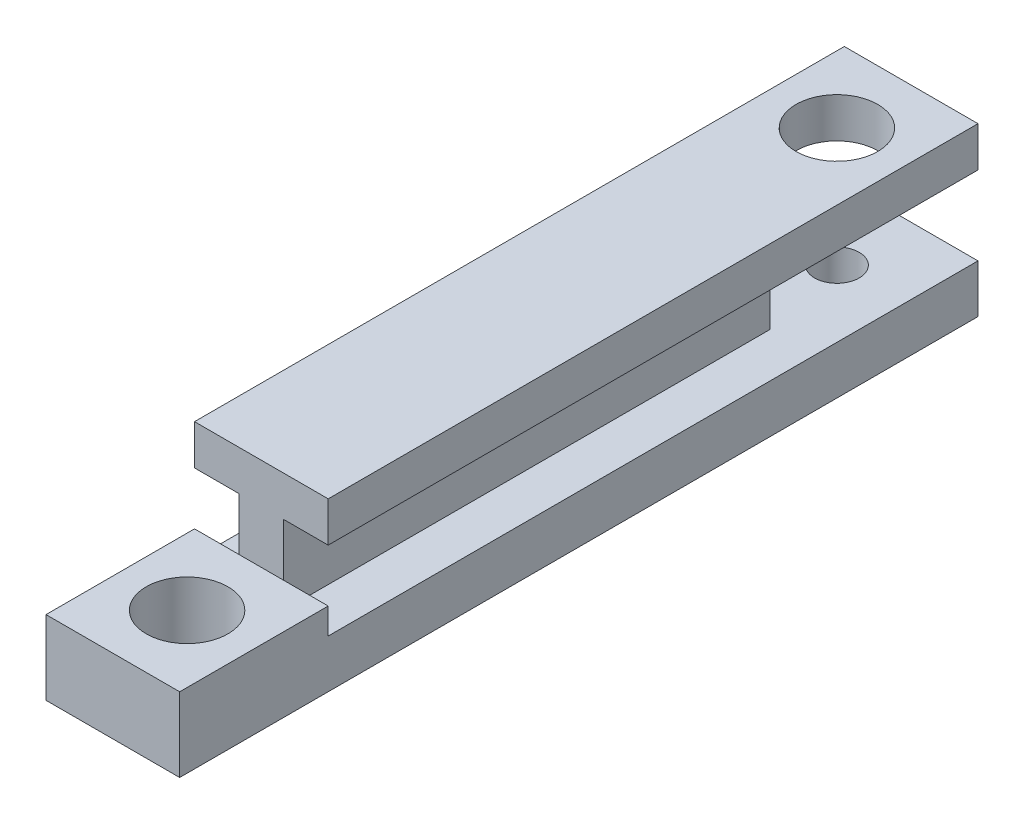
ISO-10303-21;
HEADER;
FILE_DESCRIPTION(('STEP AP214'),'2;1');
FILE_NAME('part.step','',(''),(''),'','','');
FILE_SCHEMA(('AUTOMOTIVE_DESIGN { 1 0 10303 214 1 1 1 1 }'));
ENDSEC;
DATA;
#1=APPLICATION_CONTEXT('core data for automotive mechanical design processes');
#2=APPLICATION_PROTOCOL_DEFINITION('international standard','automotive_design',2000,#1);
#3=PRODUCT_CONTEXT('',#1,'mechanical');
#4=PRODUCT('Part','Part','',(#3));
#5=PRODUCT_RELATED_PRODUCT_CATEGORY('part','',(#4));
#6=PRODUCT_DEFINITION_FORMATION('','',#4);
#7=PRODUCT_DEFINITION_CONTEXT('part definition',#1,'design');
#8=PRODUCT_DEFINITION('design','',#6,#7);
#9=PRODUCT_DEFINITION_SHAPE('','',#8);
#10=(LENGTH_UNIT() NAMED_UNIT(*) SI_UNIT(.MILLI.,.METRE.));
#11=(NAMED_UNIT(*) PLANE_ANGLE_UNIT() SI_UNIT($,.RADIAN.));
#12=(NAMED_UNIT(*) SI_UNIT($,.STERADIAN.) SOLID_ANGLE_UNIT());
#13=UNCERTAINTY_MEASURE_WITH_UNIT(LENGTH_MEASURE(1.E-05),#10,'distance_accuracy_value','');
#14=(GEOMETRIC_REPRESENTATION_CONTEXT(3) GLOBAL_UNCERTAINTY_ASSIGNED_CONTEXT((#13)) GLOBAL_UNIT_ASSIGNED_CONTEXT((#10,
#11,#12)) REPRESENTATION_CONTEXT('',''));
#15=CARTESIAN_POINT('',(0.,0.,0.));
#16=DIRECTION('',(0.,0.,1.));
#17=DIRECTION('',(1.,0.,0.));
#18=AXIS2_PLACEMENT_3D('',#15,#16,#17);
#19=CARTESIAN_POINT('',(18.,13.,44.));
#20=DIRECTION('',(0.,0.,1.));
#21=DIRECTION('',(0.,-1.,0.));
#22=AXIS2_PLACEMENT_3D('',#19,#20,#21);
#23=PLANE('',#22);
#24=DIRECTION('',(0.,1.,0.));
#25=VECTOR('',#24,1.);
#26=CARTESIAN_POINT('',(6.,0.,44.));
#27=LINE('',#26,#25);
#28=CARTESIAN_POINT('',(6.,13.,44.));
#29=VERTEX_POINT('',#28);
#30=CARTESIAN_POINT('',(6.,34.2,44.));
#31=VERTEX_POINT('',#30);
#32=EDGE_CURVE('E317',#29,#31,#27,.T.);
#33=ORIENTED_EDGE('',*,*,#32,.F.);
#34=DIRECTION('',(-1.,0.,0.));
#35=VECTOR('',#34,1.);
#36=CARTESIAN_POINT('',(18.,13.,44.));
#37=LINE('',#36,#35);
#38=CARTESIAN_POINT('',(-6.,13.,44.));
#39=VERTEX_POINT('',#38);
#40=EDGE_CURVE('E177',#29,#39,#37,.T.);
#41=ORIENTED_EDGE('',*,*,#40,.T.);
#42=DIRECTION('',(0.,1.,0.));
#43=VECTOR('',#42,1.);
#44=CARTESIAN_POINT('',(-6.,0.,44.));
#45=LINE('',#44,#43);
#46=CARTESIAN_POINT('',(-6.,34.2,44.));
#47=VERTEX_POINT('',#46);
#48=EDGE_CURVE('E285',#39,#47,#45,.T.);
#49=ORIENTED_EDGE('',*,*,#48,.T.);
#50=DIRECTION('',(-1.,0.,0.));
#51=VECTOR('',#50,1.);
#52=CARTESIAN_POINT('',(18.,34.2,44.));
#53=LINE('',#52,#51);
#54=EDGE_CURVE('E174',#31,#47,#53,.T.);
#55=ORIENTED_EDGE('',*,*,#54,.F.);
#56=EDGE_LOOP('',(#33,#41,#49,#55));
#57=FACE_BOUND('',#56,.T.);
#58=ADVANCED_FACE('F35',(#57),#23,.F.);
#59=CARTESIAN_POINT('',(18.,20.,175.));
#60=DIRECTION('',(0.,0.,-1.));
#61=DIRECTION('',(-1.,0.,0.));
#62=AXIS2_PLACEMENT_3D('',#59,#60,#61);
#63=PLANE('',#62);
#64=DIRECTION('',(1.,0.,0.));
#65=VECTOR('',#64,1.);
#66=CARTESIAN_POINT('',(6.,34.2,175.));
#67=LINE('',#66,#65);
#68=CARTESIAN_POINT('',(6.,34.2,175.));
#69=VERTEX_POINT('',#68);
#70=CARTESIAN_POINT('',(18.,34.2,175.));
#71=VERTEX_POINT('',#70);
#72=EDGE_CURVE('E137',#69,#71,#67,.T.);
#73=ORIENTED_EDGE('',*,*,#72,.T.);
#74=DIRECTION('',(0.,-1.,0.));
#75=VECTOR('',#74,1.);
#76=CARTESIAN_POINT('',(18.,20.,175.));
#77=LINE('',#76,#75);
#78=CARTESIAN_POINT('',(18.,45.,175.));
#79=VERTEX_POINT('',#78);
#80=EDGE_CURVE('E115',#79,#71,#77,.T.);
#81=ORIENTED_EDGE('',*,*,#80,.F.);
#82=DIRECTION('',(-1.,0.,0.));
#83=VECTOR('',#82,1.);
#84=CARTESIAN_POINT('',(18.,45.,175.));
#85=LINE('',#84,#83);
#86=CARTESIAN_POINT('',(-18.,45.,175.));
#87=VERTEX_POINT('',#86);
#88=EDGE_CURVE('E123',#79,#87,#85,.T.);
#89=ORIENTED_EDGE('',*,*,#88,.T.);
#90=DIRECTION('',(0.,-1.,0.));
#91=VECTOR('',#90,1.);
#92=CARTESIAN_POINT('',(-18.,20.,175.));
#93=LINE('',#92,#91);
#94=CARTESIAN_POINT('',(-18.,34.2,175.));
#95=VERTEX_POINT('',#94);
#96=EDGE_CURVE('E156',#87,#95,#93,.T.);
#97=ORIENTED_EDGE('',*,*,#96,.T.);
#98=DIRECTION('',(-1.,0.,0.));
#99=VECTOR('',#98,1.);
#100=CARTESIAN_POINT('',(-6.,34.2,175.));
#101=LINE('',#100,#99);
#102=CARTESIAN_POINT('',(-6.,34.2,175.));
#103=VERTEX_POINT('',#102);
#104=EDGE_CURVE('E223',#103,#95,#101,.T.);
#105=ORIENTED_EDGE('',*,*,#104,.F.);
#106=DIRECTION('',(0.,1.,0.));
#107=VECTOR('',#106,1.);
#108=CARTESIAN_POINT('',(-6.,0.,175.));
#109=LINE('',#108,#107);
#110=CARTESIAN_POINT('',(-6.,20.,175.));
#111=VERTEX_POINT('',#110);
#112=EDGE_CURVE('E265',#111,#103,#109,.T.);
#113=ORIENTED_EDGE('',*,*,#112,.F.);
#114=DIRECTION('',(-1.,0.,0.));
#115=VECTOR('',#114,1.);
#116=CARTESIAN_POINT('',(18.,20.,175.));
#117=LINE('',#116,#115);
#118=CARTESIAN_POINT('',(6.,20.,175.));
#119=VERTEX_POINT('',#118);
#120=EDGE_CURVE('E167',#119,#111,#117,.T.);
#121=ORIENTED_EDGE('',*,*,#120,.F.);
#122=DIRECTION('',(0.,1.,0.));
#123=VECTOR('',#122,1.);
#124=CARTESIAN_POINT('',(6.,0.,175.));
#125=LINE('',#124,#123);
#126=EDGE_CURVE('E247',#119,#69,#125,.T.);
#127=ORIENTED_EDGE('',*,*,#126,.T.);
#128=EDGE_LOOP('',(#73,#81,#89,#97,#105,#113,#121,#127));
#129=FACE_BOUND('',#128,.T.);
#130=ADVANCED_FACE('F134',(#129),#63,.F.);
#131=CARTESIAN_POINT('',(18.,0.,0.));
#132=DIRECTION('',(1.,0.,0.));
#133=DIRECTION('',(0.,0.,-1.));
#134=AXIS2_PLACEMENT_3D('',#131,#132,#133);
#135=PLANE('',#134);
#136=ORIENTED_EDGE('',*,*,#80,.T.);
#137=DIRECTION('',(0.,0.,-1.));
#138=VECTOR('',#137,1.);
#139=CARTESIAN_POINT('',(18.,34.2,44.));
#140=LINE('',#139,#138);
#141=CARTESIAN_POINT('',(18.,34.2,0.));
#142=VERTEX_POINT('',#141);
#143=EDGE_CURVE('E207',#71,#142,#140,.T.);
#144=ORIENTED_EDGE('',*,*,#143,.T.);
#145=DIRECTION('',(0.,1.,0.));
#146=VECTOR('',#145,1.);
#147=CARTESIAN_POINT('',(18.,34.2,0.));
#148=LINE('',#147,#146);
#149=CARTESIAN_POINT('',(18.,45.,0.));
#150=VERTEX_POINT('',#149);
#151=EDGE_CURVE('E117',#142,#150,#148,.T.);
#152=ORIENTED_EDGE('',*,*,#151,.T.);
#153=DIRECTION('',(0.,0.,1.));
#154=VECTOR('',#153,1.);
#155=CARTESIAN_POINT('',(18.,45.,175.));
#156=LINE('',#155,#154);
#157=EDGE_CURVE('E110',#150,#79,#156,.T.);
#158=ORIENTED_EDGE('',*,*,#157,.T.);
#159=EDGE_LOOP('',(#136,#144,#152,#158));
#160=FACE_BOUND('',#159,.T.);
#161=ADVANCED_FACE('F112',(#160),#135,.T.);
#162=DIRECTION('',(0.,0.,1.));
#163=VECTOR('',#162,1.);
#164=CARTESIAN_POINT('',(18.,13.,0.));
#165=LINE('',#164,#163);
#166=CARTESIAN_POINT('',(18.,13.,0.));
#167=VERTEX_POINT('',#166);
#168=CARTESIAN_POINT('',(18.,13.,175.));
#169=VERTEX_POINT('',#168);
#170=EDGE_CURVE('E52',#167,#169,#165,.T.);
#171=ORIENTED_EDGE('',*,*,#170,.T.);
#172=DIRECTION('',(0.,1.,0.));
#173=VECTOR('',#172,1.);
#174=CARTESIAN_POINT('',(18.,0.,175.));
#175=LINE('',#174,#173);
#176=CARTESIAN_POINT('',(18.,20.,175.));
#177=VERTEX_POINT('',#176);
#178=EDGE_CURVE('E256',#169,#177,#175,.T.);
#179=ORIENTED_EDGE('',*,*,#178,.T.);
#180=DIRECTION('',(0.,0.,1.));
#181=VECTOR('',#180,1.);
#182=CARTESIAN_POINT('',(18.,20.,215.));
#183=LINE('',#182,#181);
#184=CARTESIAN_POINT('',(18.,20.,215.));
#185=VERTEX_POINT('',#184);
#186=EDGE_CURVE('E138',#177,#185,#183,.T.);
#187=ORIENTED_EDGE('',*,*,#186,.T.);
#188=DIRECTION('',(0.,-1.,0.));
#189=VECTOR('',#188,1.);
#190=CARTESIAN_POINT('',(18.,0.,215.));
#191=LINE('',#190,#189);
#192=CARTESIAN_POINT('',(18.,0.,215.));
#193=VERTEX_POINT('',#192);
#194=EDGE_CURVE('E60',#185,#193,#191,.T.);
#195=ORIENTED_EDGE('',*,*,#194,.T.);
#196=DIRECTION('',(0.,0.,-1.));
#197=VECTOR('',#196,1.);
#198=CARTESIAN_POINT('',(18.,0.,215.));
#199=LINE('',#198,#197);
#200=CARTESIAN_POINT('',(18.,0.,0.));
#201=VERTEX_POINT('',#200);
#202=EDGE_CURVE('E95',#193,#201,#199,.T.);
#203=ORIENTED_EDGE('',*,*,#202,.T.);
#204=DIRECTION('',(0.,1.,0.));
#205=VECTOR('',#204,1.);
#206=CARTESIAN_POINT('',(18.,0.,0.));
#207=LINE('',#206,#205);
#208=EDGE_CURVE('E204',#201,#167,#207,.T.);
#209=ORIENTED_EDGE('',*,*,#208,.T.);
#210=EDGE_LOOP('',(#171,#179,#187,#195,#203,#209));
#211=FACE_BOUND('',#210,.T.);
#212=ADVANCED_FACE('F271',(#211),#135,.T.);
#213=CARTESIAN_POINT('',(-18.,0.,0.));
#214=DIRECTION('',(1.,0.,0.));
#215=DIRECTION('',(0.,0.,-1.));
#216=AXIS2_PLACEMENT_3D('',#213,#214,#215);
#217=PLANE('',#216);
#218=DIRECTION('',(0.,0.,-1.));
#219=VECTOR('',#218,1.);
#220=CARTESIAN_POINT('',(-18.,34.2,44.));
#221=LINE('',#220,#219);
#222=CARTESIAN_POINT('',(-18.,34.2,0.));
#223=VERTEX_POINT('',#222);
#224=EDGE_CURVE('E151',#95,#223,#221,.T.);
#225=ORIENTED_EDGE('',*,*,#224,.F.);
#226=ORIENTED_EDGE('',*,*,#96,.F.);
#227=DIRECTION('',(0.,0.,1.));
#228=VECTOR('',#227,1.);
#229=CARTESIAN_POINT('',(-18.,45.,175.));
#230=LINE('',#229,#228);
#231=CARTESIAN_POINT('',(-18.,45.,0.));
#232=VERTEX_POINT('',#231);
#233=EDGE_CURVE('E126',#232,#87,#230,.T.);
#234=ORIENTED_EDGE('',*,*,#233,.F.);
#235=DIRECTION('',(0.,1.,0.));
#236=VECTOR('',#235,1.);
#237=CARTESIAN_POINT('',(-18.,34.2,0.));
#238=LINE('',#237,#236);
#239=EDGE_CURVE('E153',#223,#232,#238,.T.);
#240=ORIENTED_EDGE('',*,*,#239,.F.);
#241=EDGE_LOOP('',(#225,#226,#234,#240));
#242=FACE_BOUND('',#241,.T.);
#243=ADVANCED_FACE('F218',(#242),#217,.F.);
#244=DIRECTION('',(0.,1.,0.));
#245=VECTOR('',#244,1.);
#246=CARTESIAN_POINT('',(-18.,0.,175.));
#247=LINE('',#246,#245);
#248=CARTESIAN_POINT('',(-18.,13.,175.));
#249=VERTEX_POINT('',#248);
#250=CARTESIAN_POINT('',(-18.,20.,175.));
#251=VERTEX_POINT('',#250);
#252=EDGE_CURVE('E291',#249,#251,#247,.T.);
#253=ORIENTED_EDGE('',*,*,#252,.F.);
#254=DIRECTION('',(0.,0.,1.));
#255=VECTOR('',#254,1.);
#256=CARTESIAN_POINT('',(-18.,13.,0.));
#257=LINE('',#256,#255);
#258=CARTESIAN_POINT('',(-18.,13.,0.));
#259=VERTEX_POINT('',#258);
#260=EDGE_CURVE('E148',#259,#249,#257,.T.);
#261=ORIENTED_EDGE('',*,*,#260,.F.);
#262=DIRECTION('',(0.,1.,0.));
#263=VECTOR('',#262,1.);
#264=CARTESIAN_POINT('',(-18.,0.,0.));
#265=LINE('',#264,#263);
#266=CARTESIAN_POINT('',(-18.,0.,0.));
#267=VERTEX_POINT('',#266);
#268=EDGE_CURVE('E146',#267,#259,#265,.T.);
#269=ORIENTED_EDGE('',*,*,#268,.F.);
#270=DIRECTION('',(0.,0.,-1.));
#271=VECTOR('',#270,1.);
#272=CARTESIAN_POINT('',(-18.,0.,44.));
#273=LINE('',#272,#271);
#274=CARTESIAN_POINT('',(-18.,0.,215.));
#275=VERTEX_POINT('',#274);
#276=EDGE_CURVE('E90',#275,#267,#273,.T.);
#277=ORIENTED_EDGE('',*,*,#276,.F.);
#278=DIRECTION('',(0.,-1.,0.));
#279=VECTOR('',#278,1.);
#280=CARTESIAN_POINT('',(-18.,0.,215.));
#281=LINE('',#280,#279);
#282=CARTESIAN_POINT('',(-18.,20.,215.));
#283=VERTEX_POINT('',#282);
#284=EDGE_CURVE('E160',#283,#275,#281,.T.);
#285=ORIENTED_EDGE('',*,*,#284,.F.);
#286=DIRECTION('',(0.,0.,1.));
#287=VECTOR('',#286,1.);
#288=CARTESIAN_POINT('',(-18.,20.,215.));
#289=LINE('',#288,#287);
#290=EDGE_CURVE('E158',#251,#283,#289,.T.);
#291=ORIENTED_EDGE('',*,*,#290,.F.);
#292=EDGE_LOOP('',(#253,#261,#269,#277,#285,#291));
#293=FACE_BOUND('',#292,.T.);
#294=ADVANCED_FACE('F302',(#293),#217,.F.);
#295=CARTESIAN_POINT('',(18.,0.,44.));
#296=DIRECTION('',(0.,1.,0.));
#297=DIRECTION('',(0.,0.,1.));
#298=AXIS2_PLACEMENT_3D('',#295,#296,#297);
#299=PLANE('',#298);
#300=CARTESIAN_POINT('',(0.,0.,20.));
#301=DIRECTION('',(0.,1.,0.));
#302=DIRECTION('',(0.,0.,1.));
#303=AXIS2_PLACEMENT_3D('',#300,#301,#302);
#304=CIRCLE('',#303,6.);
#305=CARTESIAN_POINT('',(0.,0.,26.));
#306=VERTEX_POINT('',#305);
#307=EDGE_CURVE('E185',#306,#306,#304,.T.);
#308=ORIENTED_EDGE('',*,*,#307,.T.);
#309=EDGE_LOOP('',(#308));
#310=FACE_BOUND('',#309,.T.);
#311=CARTESIAN_POINT('',(0.,0.,195.));
#312=DIRECTION('',(0.,1.,0.));
#313=DIRECTION('',(0.,0.,1.));
#314=AXIS2_PLACEMENT_3D('',#311,#312,#313);
#315=CIRCLE('',#314,11.);
#316=CARTESIAN_POINT('',(0.,0.,206.));
#317=VERTEX_POINT('',#316);
#318=EDGE_CURVE('E191',#317,#317,#315,.T.);
#319=ORIENTED_EDGE('',*,*,#318,.T.);
#320=EDGE_LOOP('',(#319));
#321=FACE_BOUND('',#320,.T.);
#322=ORIENTED_EDGE('',*,*,#276,.T.);
#323=DIRECTION('',(-1.,0.,0.));
#324=VECTOR('',#323,1.);
#325=CARTESIAN_POINT('',(18.,0.,0.));
#326=LINE('',#325,#324);
#327=EDGE_CURVE('E11',#201,#267,#326,.T.);
#328=ORIENTED_EDGE('',*,*,#327,.F.);
#329=ORIENTED_EDGE('',*,*,#202,.F.);
#330=DIRECTION('',(-1.,0.,0.));
#331=VECTOR('',#330,1.);
#332=CARTESIAN_POINT('',(18.,0.,215.));
#333=LINE('',#332,#331);
#334=EDGE_CURVE('E144',#193,#275,#333,.T.);
#335=ORIENTED_EDGE('',*,*,#334,.T.);
#336=EDGE_LOOP('',(#322,#328,#329,#335));
#337=FACE_BOUND('',#336,.T.);
#338=ADVANCED_FACE('F306',(#310,#321,#337),#299,.F.);
#339=CARTESIAN_POINT('',(18.,0.,0.));
#340=DIRECTION('',(0.,0.,1.));
#341=DIRECTION('',(1.,0.,0.));
#342=AXIS2_PLACEMENT_3D('',#339,#340,#341);
#343=PLANE('',#342);
#344=ORIENTED_EDGE('',*,*,#268,.T.);
#345=DIRECTION('',(-1.,0.,0.));
#346=VECTOR('',#345,1.);
#347=CARTESIAN_POINT('',(18.,13.,0.));
#348=LINE('',#347,#346);
#349=EDGE_CURVE('E44',#167,#259,#348,.T.);
#350=ORIENTED_EDGE('',*,*,#349,.F.);
#351=ORIENTED_EDGE('',*,*,#208,.F.);
#352=ORIENTED_EDGE('',*,*,#327,.T.);
#353=EDGE_LOOP('',(#344,#350,#351,#352));
#354=FACE_BOUND('',#353,.T.);
#355=ADVANCED_FACE('F310',(#354),#343,.F.);
#356=CARTESIAN_POINT('',(18.,13.,0.));
#357=DIRECTION('',(0.,-1.,0.));
#358=DIRECTION('',(0.,0.,-1.));
#359=AXIS2_PLACEMENT_3D('',#356,#357,#358);
#360=PLANE('',#359);
#361=CARTESIAN_POINT('',(0.,13.,20.));
#362=DIRECTION('',(0.,-1.,0.));
#363=DIRECTION('',(0.,0.,-1.));
#364=AXIS2_PLACEMENT_3D('',#361,#362,#363);
#365=CIRCLE('',#364,6.);
#366=CARTESIAN_POINT('',(0.,13.,26.));
#367=VERTEX_POINT('',#366);
#368=EDGE_CURVE('E39',#367,#367,#365,.T.);
#369=ORIENTED_EDGE('',*,*,#368,.T.);
#370=EDGE_LOOP('',(#369));
#371=FACE_BOUND('',#370,.T.);
#372=ORIENTED_EDGE('',*,*,#260,.T.);
#373=DIRECTION('',(-1.,0.,0.));
#374=VECTOR('',#373,1.);
#375=CARTESIAN_POINT('',(-6.,13.,175.));
#376=LINE('',#375,#374);
#377=CARTESIAN_POINT('',(-6.,13.,175.));
#378=VERTEX_POINT('',#377);
#379=EDGE_CURVE('E273',#378,#249,#376,.T.);
#380=ORIENTED_EDGE('',*,*,#379,.F.);
#381=DIRECTION('',(0.,0.,1.));
#382=VECTOR('',#381,1.);
#383=CARTESIAN_POINT('',(-6.,13.,0.));
#384=LINE('',#383,#382);
#385=EDGE_CURVE('E283',#39,#378,#384,.T.);
#386=ORIENTED_EDGE('',*,*,#385,.F.);
#387=ORIENTED_EDGE('',*,*,#40,.F.);
#388=DIRECTION('',(0.,0.,1.));
#389=VECTOR('',#388,1.);
#390=CARTESIAN_POINT('',(6.,13.,0.));
#391=LINE('',#390,#389);
#392=CARTESIAN_POINT('',(6.,13.,175.));
#393=VERTEX_POINT('',#392);
#394=EDGE_CURVE('E262',#29,#393,#391,.T.);
#395=ORIENTED_EDGE('',*,*,#394,.T.);
#396=DIRECTION('',(1.,0.,0.));
#397=VECTOR('',#396,1.);
#398=CARTESIAN_POINT('',(6.,13.,175.));
#399=LINE('',#398,#397);
#400=EDGE_CURVE('E261',#393,#169,#399,.T.);
#401=ORIENTED_EDGE('',*,*,#400,.T.);
#402=ORIENTED_EDGE('',*,*,#170,.F.);
#403=ORIENTED_EDGE('',*,*,#349,.T.);
#404=EDGE_LOOP('',(#372,#380,#386,#387,#395,#401,#402,#403));
#405=FACE_BOUND('',#404,.T.);
#406=ADVANCED_FACE('F311',(#371,#405),#360,.F.);
#407=CARTESIAN_POINT('',(18.,34.2,44.));
#408=DIRECTION('',(0.,1.,0.));
#409=DIRECTION('',(0.,0.,1.));
#410=AXIS2_PLACEMENT_3D('',#407,#408,#409);
#411=PLANE('',#410);
#412=CARTESIAN_POINT('',(0.,34.2,20.));
#413=DIRECTION('',(0.,1.,0.));
#414=DIRECTION('',(0.,0.,1.));
#415=AXIS2_PLACEMENT_3D('',#412,#413,#414);
#416=CIRCLE('',#415,11.);
#417=CARTESIAN_POINT('',(0.,34.2,31.));
#418=VERTEX_POINT('',#417);
#419=EDGE_CURVE('E184',#418,#418,#416,.T.);
#420=ORIENTED_EDGE('',*,*,#419,.T.);
#421=EDGE_LOOP('',(#420));
#422=FACE_BOUND('',#421,.T.);
#423=ORIENTED_EDGE('',*,*,#224,.T.);
#424=DIRECTION('',(-1.,0.,0.));
#425=VECTOR('',#424,1.);
#426=CARTESIAN_POINT('',(18.,34.2,0.));
#427=LINE('',#426,#425);
#428=EDGE_CURVE('E171',#142,#223,#427,.T.);
#429=ORIENTED_EDGE('',*,*,#428,.F.);
#430=ORIENTED_EDGE('',*,*,#143,.F.);
#431=ORIENTED_EDGE('',*,*,#72,.F.);
#432=DIRECTION('',(0.,0.,-1.));
#433=VECTOR('',#432,1.);
#434=CARTESIAN_POINT('',(6.,34.2,0.));
#435=LINE('',#434,#433);
#436=EDGE_CURVE('E254',#69,#31,#435,.T.);
#437=ORIENTED_EDGE('',*,*,#436,.T.);
#438=ORIENTED_EDGE('',*,*,#54,.T.);
#439=DIRECTION('',(0.,0.,-1.));
#440=VECTOR('',#439,1.);
#441=CARTESIAN_POINT('',(-6.,34.2,0.));
#442=LINE('',#441,#440);
#443=EDGE_CURVE('E288',#103,#47,#442,.T.);
#444=ORIENTED_EDGE('',*,*,#443,.F.);
#445=ORIENTED_EDGE('',*,*,#104,.T.);
#446=EDGE_LOOP('',(#423,#429,#430,#431,#437,#438,#444,#445));
#447=FACE_BOUND('',#446,.T.);
#448=ADVANCED_FACE('F211',(#422,#447),#411,.F.);
#449=CARTESIAN_POINT('',(18.,34.2,0.));
#450=DIRECTION('',(0.,0.,1.));
#451=DIRECTION('',(1.,0.,0.));
#452=AXIS2_PLACEMENT_3D('',#449,#450,#451);
#453=PLANE('',#452);
#454=ORIENTED_EDGE('',*,*,#239,.T.);
#455=DIRECTION('',(-1.,0.,0.));
#456=VECTOR('',#455,1.);
#457=CARTESIAN_POINT('',(18.,45.,0.));
#458=LINE('',#457,#456);
#459=EDGE_CURVE('E130',#150,#232,#458,.T.);
#460=ORIENTED_EDGE('',*,*,#459,.F.);
#461=ORIENTED_EDGE('',*,*,#151,.F.);
#462=ORIENTED_EDGE('',*,*,#428,.T.);
#463=EDGE_LOOP('',(#454,#460,#461,#462));
#464=FACE_BOUND('',#463,.T.);
#465=ADVANCED_FACE('F216',(#464),#453,.F.);
#466=CARTESIAN_POINT('',(18.,45.,175.));
#467=DIRECTION('',(0.,-1.,0.));
#468=DIRECTION('',(0.,0.,-1.));
#469=AXIS2_PLACEMENT_3D('',#466,#467,#468);
#470=PLANE('',#469);
#471=CARTESIAN_POINT('',(0.,45.,20.));
#472=DIRECTION('',(0.,1.,0.));
#473=DIRECTION('',(0.,0.,1.));
#474=AXIS2_PLACEMENT_3D('',#471,#472,#473);
#475=CIRCLE('',#474,11.);
#476=CARTESIAN_POINT('',(0.,45.,31.));
#477=VERTEX_POINT('',#476);
#478=EDGE_CURVE('E187',#477,#477,#475,.T.);
#479=ORIENTED_EDGE('',*,*,#478,.F.);
#480=EDGE_LOOP('',(#479));
#481=FACE_BOUND('',#480,.T.);
#482=ORIENTED_EDGE('',*,*,#233,.T.);
#483=ORIENTED_EDGE('',*,*,#88,.F.);
#484=ORIENTED_EDGE('',*,*,#157,.F.);
#485=ORIENTED_EDGE('',*,*,#459,.T.);
#486=EDGE_LOOP('',(#482,#483,#484,#485));
#487=FACE_BOUND('',#486,.T.);
#488=ADVANCED_FACE('F124',(#481,#487),#470,.F.);
#489=CARTESIAN_POINT('',(18.,20.,215.));
#490=DIRECTION('',(0.,-1.,0.));
#491=DIRECTION('',(0.,0.,-1.));
#492=AXIS2_PLACEMENT_3D('',#489,#490,#491);
#493=PLANE('',#492);
#494=CARTESIAN_POINT('',(0.,20.,195.));
#495=DIRECTION('',(0.,-1.,0.));
#496=DIRECTION('',(0.,0.,-1.));
#497=AXIS2_PLACEMENT_3D('',#494,#495,#496);
#498=CIRCLE('',#497,11.);
#499=CARTESIAN_POINT('',(0.,20.,206.));
#500=VERTEX_POINT('',#499);
#501=EDGE_CURVE('E182',#500,#500,#498,.T.);
#502=ORIENTED_EDGE('',*,*,#501,.T.);
#503=EDGE_LOOP('',(#502));
#504=FACE_BOUND('',#503,.T.);
#505=ORIENTED_EDGE('',*,*,#290,.T.);
#506=DIRECTION('',(-1.,0.,0.));
#507=VECTOR('',#506,1.);
#508=CARTESIAN_POINT('',(18.,20.,215.));
#509=LINE('',#508,#507);
#510=EDGE_CURVE('E164',#185,#283,#509,.T.);
#511=ORIENTED_EDGE('',*,*,#510,.F.);
#512=ORIENTED_EDGE('',*,*,#186,.F.);
#513=EDGE_CURVE('E131',#177,#119,#117,.T.);
#514=ORIENTED_EDGE('',*,*,#513,.T.);
#515=ORIENTED_EDGE('',*,*,#120,.T.);
#516=DIRECTION('',(1.,0.,0.));
#517=VECTOR('',#516,1.);
#518=CARTESIAN_POINT('',(18.,20.,175.));
#519=LINE('',#518,#517);
#520=EDGE_CURVE('E196',#251,#111,#519,.T.);
#521=ORIENTED_EDGE('',*,*,#520,.F.);
#522=EDGE_LOOP('',(#505,#511,#512,#514,#515,#521));
#523=FACE_BOUND('',#522,.T.);
#524=ADVANCED_FACE('F269',(#504,#523),#493,.F.);
#525=CARTESIAN_POINT('',(18.,0.,215.));
#526=DIRECTION('',(0.,0.,-1.));
#527=DIRECTION('',(0.,1.,0.));
#528=AXIS2_PLACEMENT_3D('',#525,#526,#527);
#529=PLANE('',#528);
#530=ORIENTED_EDGE('',*,*,#284,.T.);
#531=ORIENTED_EDGE('',*,*,#334,.F.);
#532=ORIENTED_EDGE('',*,*,#194,.F.);
#533=ORIENTED_EDGE('',*,*,#510,.T.);
#534=EDGE_LOOP('',(#530,#531,#532,#533));
#535=FACE_BOUND('',#534,.T.);
#536=ADVANCED_FACE('F304',(#535),#529,.F.);
#537=CARTESIAN_POINT('',(0.,0.,195.));
#538=DIRECTION('',(0.,1.,0.));
#539=DIRECTION('',(0.,0.,1.));
#540=AXIS2_PLACEMENT_3D('',#537,#538,#539);
#541=CYLINDRICAL_SURFACE('',#540,11.);
#542=CARTESIAN_POINT('',(0.,0.,206.));
#543=CARTESIAN_POINT('',(0.,0.208333333333334,206.));
#544=CARTESIAN_POINT('',(0.,0.416666666666667,206.));
#545=CARTESIAN_POINT('',(0.,0.833333333333333,206.));
#546=CARTESIAN_POINT('',(0.,1.04166666666667,206.));
#547=CARTESIAN_POINT('',(0.,1.45833333333333,206.));
#548=CARTESIAN_POINT('',(0.,1.66666666666667,206.));
#549=CARTESIAN_POINT('',(0.,2.08333333333333,206.));
#550=CARTESIAN_POINT('',(0.,2.29166666666667,206.));
#551=CARTESIAN_POINT('',(0.,2.70833333333333,206.));
#552=CARTESIAN_POINT('',(0.,2.91666666666667,206.));
#553=CARTESIAN_POINT('',(0.,3.33333333333333,206.));
#554=CARTESIAN_POINT('',(0.,3.54166666666667,206.));
#555=CARTESIAN_POINT('',(0.,3.95833333333333,206.));
#556=CARTESIAN_POINT('',(0.,4.16666666666667,206.));
#557=CARTESIAN_POINT('',(0.,4.58333333333333,206.));
#558=CARTESIAN_POINT('',(0.,4.79166666666667,206.));
#559=CARTESIAN_POINT('',(0.,5.20833333333333,206.));
#560=CARTESIAN_POINT('',(0.,5.41666666666667,206.));
#561=CARTESIAN_POINT('',(0.,5.83333333333333,206.));
#562=CARTESIAN_POINT('',(0.,6.04166666666667,206.));
#563=CARTESIAN_POINT('',(0.,6.45833333333333,206.));
#564=CARTESIAN_POINT('',(0.,6.66666666666667,206.));
#565=CARTESIAN_POINT('',(0.,7.08333333333333,206.));
#566=CARTESIAN_POINT('',(0.,7.29166666666667,206.));
#567=CARTESIAN_POINT('',(0.,7.70833333333333,206.));
#568=CARTESIAN_POINT('',(0.,7.91666666666667,206.));
#569=CARTESIAN_POINT('',(0.,8.33333333333333,206.));
#570=CARTESIAN_POINT('',(0.,8.54166666666667,206.));
#571=CARTESIAN_POINT('',(0.,8.95833333333333,206.));
#572=CARTESIAN_POINT('',(0.,9.16666666666667,206.));
#573=CARTESIAN_POINT('',(0.,9.58333333333333,206.));
#574=CARTESIAN_POINT('',(0.,9.79166666666667,206.));
#575=CARTESIAN_POINT('',(0.,10.2083333333333,206.));
#576=CARTESIAN_POINT('',(0.,10.4166666666667,206.));
#577=CARTESIAN_POINT('',(0.,10.8333333333333,206.));
#578=CARTESIAN_POINT('',(0.,11.0416666666667,206.));
#579=CARTESIAN_POINT('',(0.,11.4583333333333,206.));
#580=CARTESIAN_POINT('',(0.,11.6666666666667,206.));
#581=CARTESIAN_POINT('',(0.,12.0833333333333,206.));
#582=CARTESIAN_POINT('',(0.,12.2916666666667,206.));
#583=CARTESIAN_POINT('',(0.,12.7083333333333,206.));
#584=CARTESIAN_POINT('',(0.,12.9166666666667,206.));
#585=CARTESIAN_POINT('',(0.,13.3333333333333,206.));
#586=CARTESIAN_POINT('',(0.,13.5416666666667,206.));
#587=CARTESIAN_POINT('',(0.,13.9583333333333,206.));
#588=CARTESIAN_POINT('',(0.,14.1666666666667,206.));
#589=CARTESIAN_POINT('',(0.,14.5833333333333,206.));
#590=CARTESIAN_POINT('',(0.,14.7916666666667,206.));
#591=CARTESIAN_POINT('',(0.,15.2083333333333,206.));
#592=CARTESIAN_POINT('',(0.,15.4166666666667,206.));
#593=CARTESIAN_POINT('',(0.,15.8333333333333,206.));
#594=CARTESIAN_POINT('',(0.,16.0416666666667,206.));
#595=CARTESIAN_POINT('',(0.,16.4583333333333,206.));
#596=CARTESIAN_POINT('',(0.,16.6666666666667,206.));
#597=CARTESIAN_POINT('',(0.,17.0833333333333,206.));
#598=CARTESIAN_POINT('',(0.,17.2916666666667,206.));
#599=CARTESIAN_POINT('',(0.,17.7083333333333,206.));
#600=CARTESIAN_POINT('',(0.,17.9166666666667,206.));
#601=CARTESIAN_POINT('',(0.,18.3333333333333,206.));
#602=CARTESIAN_POINT('',(0.,18.5416666666667,206.));
#603=CARTESIAN_POINT('',(0.,18.9583333333333,206.));
#604=CARTESIAN_POINT('',(0.,19.1666666666667,206.));
#605=CARTESIAN_POINT('',(0.,19.5833333333333,206.));
#606=CARTESIAN_POINT('',(0.,19.7916666666667,206.));
#607=CARTESIAN_POINT('',(0.,20.,206.));
#608=B_SPLINE_CURVE_WITH_KNOTS('',3,(#542,#543,#544,#545,#546,#547,#548,#549,#550,#551,#552,
#553,#554,#555,#556,#557,#558,#559,#560,#561,#562,#563,#564,#565,#566,#567,#568,#569,#570,#571,
#572,#573,#574,#575,#576,#577,#578,#579,#580,#581,#582,#583,#584,#585,#586,#587,#588,#589,#590,
#591,#592,#593,#594,#595,#596,#597,#598,#599,#600,#601,#602,#603,#604,#605,#606,#607),
.UNSPECIFIED.,.F.,.F.,(4,2,2,2,2,2,2,2,2,2,2,2,2,2,2,2,2,2,2,2,2,2,2,2,2,2,2,2,2,2,2,2,4),(0.,
0.625,1.25,1.875,2.5,3.125,3.75,4.375,5.,5.625,6.25,6.875,7.5,8.125,8.75,9.375,10.,10.625,11.25,
11.875,12.5,13.125,13.75,14.375,15.,15.625,16.25,16.875,17.5,18.125,18.75,19.375,20.),.UNSPECIFIED.);
#609=EDGE_CURVE('BSEAM354',#317,#500,#608,.T.);
#610=ORIENTED_EDGE('',*,*,#318,.F.);
#611=ORIENTED_EDGE('',*,*,#501,.F.);
#612=ORIENTED_EDGE('',*,*,#609,.T.);
#613=ORIENTED_EDGE('',*,*,#609,.F.);
#614=EDGE_LOOP('',(#610,#612,#611,#613));
#615=FACE_BOUND('',#614,.T.);
#616=ADVANCED_FACE('F354',(#615),#541,.F.);
#617=CARTESIAN_POINT('',(0.,0.,20.));
#618=DIRECTION('',(0.,1.,0.));
#619=DIRECTION('',(0.,0.,1.));
#620=AXIS2_PLACEMENT_3D('',#617,#618,#619);
#621=CYLINDRICAL_SURFACE('',#620,11.);
#622=CARTESIAN_POINT('',(0.,45.,31.));
#623=CARTESIAN_POINT('',(0.,44.8875,31.));
#624=CARTESIAN_POINT('',(0.,44.775,31.));
#625=CARTESIAN_POINT('',(0.,44.55,31.));
#626=CARTESIAN_POINT('',(0.,44.4375,31.));
#627=CARTESIAN_POINT('',(0.,44.2125,31.));
#628=CARTESIAN_POINT('',(0.,44.1,31.));
#629=CARTESIAN_POINT('',(0.,43.875,31.));
#630=CARTESIAN_POINT('',(0.,43.7625,31.));
#631=CARTESIAN_POINT('',(0.,43.5375,31.));
#632=CARTESIAN_POINT('',(0.,43.425,31.));
#633=CARTESIAN_POINT('',(0.,43.2,31.));
#634=CARTESIAN_POINT('',(0.,43.0875,31.));
#635=CARTESIAN_POINT('',(0.,42.8625,31.));
#636=CARTESIAN_POINT('',(0.,42.75,31.));
#637=CARTESIAN_POINT('',(0.,42.525,31.));
#638=CARTESIAN_POINT('',(0.,42.4125,31.));
#639=CARTESIAN_POINT('',(0.,42.1875,31.));
#640=CARTESIAN_POINT('',(0.,42.075,31.));
#641=CARTESIAN_POINT('',(0.,41.85,31.));
#642=CARTESIAN_POINT('',(0.,41.7375,31.));
#643=CARTESIAN_POINT('',(0.,41.5125,31.));
#644=CARTESIAN_POINT('',(0.,41.4,31.));
#645=CARTESIAN_POINT('',(0.,41.175,31.));
#646=CARTESIAN_POINT('',(0.,41.0625,31.));
#647=CARTESIAN_POINT('',(0.,40.8375,31.));
#648=CARTESIAN_POINT('',(0.,40.725,31.));
#649=CARTESIAN_POINT('',(0.,40.5,31.));
#650=CARTESIAN_POINT('',(0.,40.3875,31.));
#651=CARTESIAN_POINT('',(0.,40.1625,31.));
#652=CARTESIAN_POINT('',(0.,40.05,31.));
#653=CARTESIAN_POINT('',(0.,39.825,31.));
#654=CARTESIAN_POINT('',(0.,39.7125,31.));
#655=CARTESIAN_POINT('',(0.,39.4875,31.));
#656=CARTESIAN_POINT('',(0.,39.375,31.));
#657=CARTESIAN_POINT('',(0.,39.15,31.));
#658=CARTESIAN_POINT('',(0.,39.0375,31.));
#659=CARTESIAN_POINT('',(0.,38.8125,31.));
#660=CARTESIAN_POINT('',(0.,38.7,31.));
#661=CARTESIAN_POINT('',(0.,38.475,31.));
#662=CARTESIAN_POINT('',(0.,38.3625,31.));
#663=CARTESIAN_POINT('',(0.,38.1375,31.));
#664=CARTESIAN_POINT('',(0.,38.025,31.));
#665=CARTESIAN_POINT('',(0.,37.8,31.));
#666=CARTESIAN_POINT('',(0.,37.6875,31.));
#667=CARTESIAN_POINT('',(0.,37.4625,31.));
#668=CARTESIAN_POINT('',(0.,37.35,31.));
#669=CARTESIAN_POINT('',(0.,37.125,31.));
#670=CARTESIAN_POINT('',(0.,37.0125,31.));
#671=CARTESIAN_POINT('',(0.,36.7875,31.));
#672=CARTESIAN_POINT('',(0.,36.675,31.));
#673=CARTESIAN_POINT('',(0.,36.45,31.));
#674=CARTESIAN_POINT('',(0.,36.3375,31.));
#675=CARTESIAN_POINT('',(0.,36.1125,31.));
#676=CARTESIAN_POINT('',(0.,36.,31.));
#677=CARTESIAN_POINT('',(0.,35.775,31.));
#678=CARTESIAN_POINT('',(0.,35.6625,31.));
#679=CARTESIAN_POINT('',(0.,35.4375,31.));
#680=CARTESIAN_POINT('',(0.,35.325,31.));
#681=CARTESIAN_POINT('',(0.,35.1,31.));
#682=CARTESIAN_POINT('',(0.,34.9875,31.));
#683=CARTESIAN_POINT('',(0.,34.7625,31.));
#684=CARTESIAN_POINT('',(0.,34.65,31.));
#685=CARTESIAN_POINT('',(0.,34.425,31.));
#686=CARTESIAN_POINT('',(0.,34.3125,31.));
#687=CARTESIAN_POINT('',(0.,34.2,31.));
#688=B_SPLINE_CURVE_WITH_KNOTS('',3,(#622,#623,#624,#625,#626,#627,#628,#629,#630,#631,#632,
#633,#634,#635,#636,#637,#638,#639,#640,#641,#642,#643,#644,#645,#646,#647,#648,#649,#650,#651,
#652,#653,#654,#655,#656,#657,#658,#659,#660,#661,#662,#663,#664,#665,#666,#667,#668,#669,#670,
#671,#672,#673,#674,#675,#676,#677,#678,#679,#680,#681,#682,#683,#684,#685,#686,#687),
.UNSPECIFIED.,.F.,.F.,(4,2,2,2,2,2,2,2,2,2,2,2,2,2,2,2,2,2,2,2,2,2,2,2,2,2,2,2,2,2,2,2,4),(0.,
0.337499999999998,0.675000000000002,1.0125,1.35,1.6875,2.025,2.3625,2.69999999999999,3.0375,
3.375,3.71249999999999,4.05,4.3875,4.72499999999999,5.0625,5.4,5.73749999999999,6.075,
6.41249999999999,6.74999999999999,7.0875,7.42499999999999,7.76249999999999,8.1,8.43749999999999,
8.77499999999999,9.1125,9.44999999999999,9.78749999999999,10.125,10.4625,10.8),.UNSPECIFIED.);
#689=EDGE_CURVE('BSEAM357',#477,#418,#688,.T.);
#690=ORIENTED_EDGE('',*,*,#478,.T.);
#691=ORIENTED_EDGE('',*,*,#419,.F.);
#692=ORIENTED_EDGE('',*,*,#689,.T.);
#693=ORIENTED_EDGE('',*,*,#689,.F.);
#694=EDGE_LOOP('',(#690,#692,#691,#693));
#695=FACE_BOUND('',#694,.T.);
#696=ADVANCED_FACE('F357',(#695),#621,.F.);
#697=CARTESIAN_POINT('',(0.,0.,20.));
#698=DIRECTION('',(0.,1.,0.));
#699=DIRECTION('',(0.,0.,1.));
#700=AXIS2_PLACEMENT_3D('',#697,#698,#699);
#701=CYLINDRICAL_SURFACE('',#700,6.);
#702=CARTESIAN_POINT('',(0.,0.,26.));
#703=CARTESIAN_POINT('',(0.,0.135416666666666,26.));
#704=CARTESIAN_POINT('',(0.,0.270833333333333,26.));
#705=CARTESIAN_POINT('',(0.,0.541666666666667,26.));
#706=CARTESIAN_POINT('',(0.,0.677083333333333,26.));
#707=CARTESIAN_POINT('',(0.,0.947916666666667,26.));
#708=CARTESIAN_POINT('',(0.,1.08333333333333,26.));
#709=CARTESIAN_POINT('',(0.,1.35416666666667,26.));
#710=CARTESIAN_POINT('',(0.,1.48958333333333,26.));
#711=CARTESIAN_POINT('',(0.,1.76041666666667,26.));
#712=CARTESIAN_POINT('',(0.,1.89583333333333,26.));
#713=CARTESIAN_POINT('',(0.,2.16666666666667,26.));
#714=CARTESIAN_POINT('',(0.,2.30208333333333,26.));
#715=CARTESIAN_POINT('',(0.,2.57291666666667,26.));
#716=CARTESIAN_POINT('',(0.,2.70833333333333,26.));
#717=CARTESIAN_POINT('',(0.,2.97916666666667,26.));
#718=CARTESIAN_POINT('',(0.,3.11458333333333,26.));
#719=CARTESIAN_POINT('',(0.,3.38541666666667,26.));
#720=CARTESIAN_POINT('',(0.,3.52083333333333,26.));
#721=CARTESIAN_POINT('',(0.,3.79166666666667,26.));
#722=CARTESIAN_POINT('',(0.,3.92708333333333,26.));
#723=CARTESIAN_POINT('',(0.,4.19791666666667,26.));
#724=CARTESIAN_POINT('',(0.,4.33333333333333,26.));
#725=CARTESIAN_POINT('',(0.,4.60416666666667,26.));
#726=CARTESIAN_POINT('',(0.,4.73958333333333,26.));
#727=CARTESIAN_POINT('',(0.,5.01041666666667,26.));
#728=CARTESIAN_POINT('',(0.,5.14583333333333,26.));
#729=CARTESIAN_POINT('',(0.,5.41666666666667,26.));
#730=CARTESIAN_POINT('',(0.,5.55208333333333,26.));
#731=CARTESIAN_POINT('',(0.,5.82291666666667,26.));
#732=CARTESIAN_POINT('',(0.,5.95833333333333,26.));
#733=CARTESIAN_POINT('',(0.,6.22916666666667,26.));
#734=CARTESIAN_POINT('',(0.,6.36458333333333,26.));
#735=CARTESIAN_POINT('',(0.,6.63541666666667,26.));
#736=CARTESIAN_POINT('',(0.,6.77083333333333,26.));
#737=CARTESIAN_POINT('',(0.,7.04166666666667,26.));
#738=CARTESIAN_POINT('',(0.,7.17708333333333,26.));
#739=CARTESIAN_POINT('',(0.,7.44791666666667,26.));
#740=CARTESIAN_POINT('',(0.,7.58333333333333,26.));
#741=CARTESIAN_POINT('',(0.,7.85416666666667,26.));
#742=CARTESIAN_POINT('',(0.,7.98958333333333,26.));
#743=CARTESIAN_POINT('',(0.,8.26041666666667,26.));
#744=CARTESIAN_POINT('',(0.,8.39583333333333,26.));
#745=CARTESIAN_POINT('',(0.,8.66666666666667,26.));
#746=CARTESIAN_POINT('',(0.,8.80208333333333,26.));
#747=CARTESIAN_POINT('',(0.,9.07291666666667,26.));
#748=CARTESIAN_POINT('',(0.,9.20833333333333,26.));
#749=CARTESIAN_POINT('',(0.,9.47916666666667,26.));
#750=CARTESIAN_POINT('',(0.,9.61458333333333,26.));
#751=CARTESIAN_POINT('',(0.,9.88541666666667,26.));
#752=CARTESIAN_POINT('',(0.,10.0208333333333,26.));
#753=CARTESIAN_POINT('',(0.,10.2916666666667,26.));
#754=CARTESIAN_POINT('',(0.,10.4270833333333,26.));
#755=CARTESIAN_POINT('',(0.,10.6979166666667,26.));
#756=CARTESIAN_POINT('',(0.,10.8333333333333,26.));
#757=CARTESIAN_POINT('',(0.,11.1041666666667,26.));
#758=CARTESIAN_POINT('',(0.,11.2395833333333,26.));
#759=CARTESIAN_POINT('',(0.,11.5104166666667,26.));
#760=CARTESIAN_POINT('',(0.,11.6458333333333,26.));
#761=CARTESIAN_POINT('',(0.,11.9166666666667,26.));
#762=CARTESIAN_POINT('',(0.,12.0520833333333,26.));
#763=CARTESIAN_POINT('',(0.,12.3229166666667,26.));
#764=CARTESIAN_POINT('',(0.,12.4583333333333,26.));
#765=CARTESIAN_POINT('',(0.,12.7291666666667,26.));
#766=CARTESIAN_POINT('',(0.,12.8645833333333,26.));
#767=CARTESIAN_POINT('',(0.,13.,26.));
#768=B_SPLINE_CURVE_WITH_KNOTS('',3,(#702,#703,#704,#705,#706,#707,#708,#709,#710,#711,#712,
#713,#714,#715,#716,#717,#718,#719,#720,#721,#722,#723,#724,#725,#726,#727,#728,#729,#730,#731,
#732,#733,#734,#735,#736,#737,#738,#739,#740,#741,#742,#743,#744,#745,#746,#747,#748,#749,#750,
#751,#752,#753,#754,#755,#756,#757,#758,#759,#760,#761,#762,#763,#764,#765,#766,#767),
.UNSPECIFIED.,.F.,.F.,(4,2,2,2,2,2,2,2,2,2,2,2,2,2,2,2,2,2,2,2,2,2,2,2,2,2,2,2,2,2,2,2,4),(0.,
0.40625,0.8125,1.21875,1.625,2.03125,2.4375,2.84375,3.25,3.65625,4.0625,4.46875,4.875,5.28125,
5.6875,6.09375,6.5,6.90625,7.3125,7.71875,8.125,8.53125,8.9375,9.34375,9.75,10.15625,10.5625,
10.96875,11.375,11.78125,12.1875,12.59375,13.),.UNSPECIFIED.);
#769=EDGE_CURVE('BSEAM37',#306,#367,#768,.T.);
#770=ORIENTED_EDGE('',*,*,#307,.F.);
#771=ORIENTED_EDGE('',*,*,#368,.F.);
#772=ORIENTED_EDGE('',*,*,#769,.T.);
#773=ORIENTED_EDGE('',*,*,#769,.F.);
#774=EDGE_LOOP('',(#770,#772,#771,#773));
#775=FACE_BOUND('',#774,.T.);
#776=ADVANCED_FACE('F37',(#775),#701,.F.);
#777=CARTESIAN_POINT('',(-6.,0.,175.));
#778=DIRECTION('',(0.,0.,-1.));
#779=DIRECTION('',(1.,0.,0.));
#780=AXIS2_PLACEMENT_3D('',#777,#778,#779);
#781=PLANE('',#780);
#782=ORIENTED_EDGE('',*,*,#520,.T.);
#783=EDGE_CURVE('E280',#378,#111,#109,.T.);
#784=ORIENTED_EDGE('',*,*,#783,.F.);
#785=ORIENTED_EDGE('',*,*,#379,.T.);
#786=ORIENTED_EDGE('',*,*,#252,.T.);
#787=EDGE_LOOP('',(#782,#784,#785,#786));
#788=FACE_BOUND('',#787,.T.);
#789=ADVANCED_FACE('F297',(#788),#781,.T.);
#790=CARTESIAN_POINT('',(-6.,0.,0.));
#791=DIRECTION('',(-1.,0.,0.));
#792=DIRECTION('',(0.,0.,-1.));
#793=AXIS2_PLACEMENT_3D('',#790,#791,#792);
#794=PLANE('',#793);
#795=ORIENTED_EDGE('',*,*,#783,.T.);
#796=ORIENTED_EDGE('',*,*,#112,.T.);
#797=ORIENTED_EDGE('',*,*,#443,.T.);
#798=ORIENTED_EDGE('',*,*,#48,.F.);
#799=ORIENTED_EDGE('',*,*,#385,.T.);
#800=EDGE_LOOP('',(#795,#796,#797,#798,#799));
#801=FACE_BOUND('',#800,.T.);
#802=ADVANCED_FACE('F330',(#801),#794,.T.);
#803=CARTESIAN_POINT('',(6.,0.,175.));
#804=DIRECTION('',(0.,0.,-1.));
#805=DIRECTION('',(-1.,0.,0.));
#806=AXIS2_PLACEMENT_3D('',#803,#804,#805);
#807=PLANE('',#806);
#808=ORIENTED_EDGE('',*,*,#513,.F.);
#809=ORIENTED_EDGE('',*,*,#178,.F.);
#810=ORIENTED_EDGE('',*,*,#400,.F.);
#811=EDGE_CURVE('E251',#393,#119,#125,.T.);
#812=ORIENTED_EDGE('',*,*,#811,.T.);
#813=EDGE_LOOP('',(#808,#809,#810,#812));
#814=FACE_BOUND('',#813,.T.);
#815=ADVANCED_FACE('F259',(#814),#807,.T.);
#816=CARTESIAN_POINT('',(6.,0.,0.));
#817=DIRECTION('',(1.,0.,0.));
#818=DIRECTION('',(0.,0.,-1.));
#819=AXIS2_PLACEMENT_3D('',#816,#817,#818);
#820=PLANE('',#819);
#821=ORIENTED_EDGE('',*,*,#811,.F.);
#822=ORIENTED_EDGE('',*,*,#394,.F.);
#823=ORIENTED_EDGE('',*,*,#32,.T.);
#824=ORIENTED_EDGE('',*,*,#436,.F.);
#825=ORIENTED_EDGE('',*,*,#126,.F.);
#826=EDGE_LOOP('',(#821,#822,#823,#824,#825));
#827=FACE_BOUND('',#826,.T.);
#828=ADVANCED_FACE('F248',(#827),#820,.T.);
#829=CLOSED_SHELL('',(#58,#130,#161,#212,#243,#294,#338,#355,#406,#448,#465,#488,#524,#536,#616,
#696,#776,#789,#802,#815,#828));
#830=MANIFOLD_SOLID_BREP('B2',#829);
#831=ADVANCED_BREP_SHAPE_REPRESENTATION('',(#18,#830),#14);
#832=SHAPE_DEFINITION_REPRESENTATION(#9,#831);
ENDSEC;
END-ISO-10303-21;
